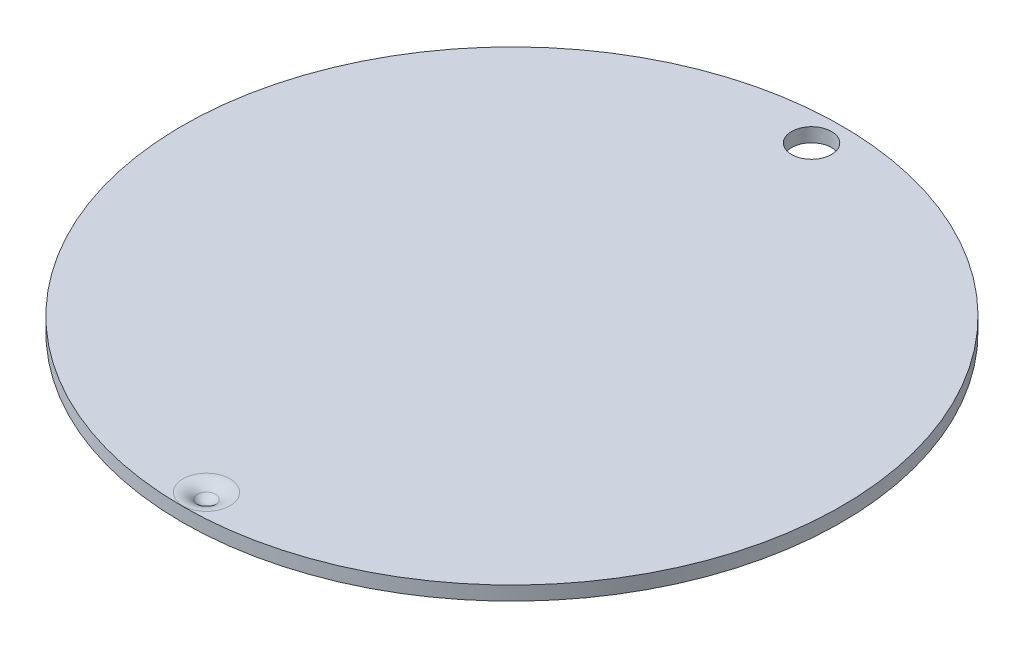
ISO-10303-21;
HEADER;
FILE_DESCRIPTION(('STEP AP214'),'2;1');
FILE_NAME('part.step','',(''),(''),'','','');
FILE_SCHEMA(('AUTOMOTIVE_DESIGN { 1 0 10303 214 1 1 1 1 }'));
ENDSEC;
DATA;
#1=APPLICATION_CONTEXT('core data for automotive mechanical design processes');
#2=APPLICATION_PROTOCOL_DEFINITION('international standard','automotive_design',2000,#1);
#3=PRODUCT_CONTEXT('',#1,'mechanical');
#4=PRODUCT('Part','Part','',(#3));
#5=PRODUCT_RELATED_PRODUCT_CATEGORY('part','',(#4));
#6=PRODUCT_DEFINITION_FORMATION('','',#4);
#7=PRODUCT_DEFINITION_CONTEXT('part definition',#1,'design');
#8=PRODUCT_DEFINITION('design','',#6,#7);
#9=PRODUCT_DEFINITION_SHAPE('','',#8);
#10=(LENGTH_UNIT() NAMED_UNIT(*) SI_UNIT(.MILLI.,.METRE.));
#11=(NAMED_UNIT(*) PLANE_ANGLE_UNIT() SI_UNIT($,.RADIAN.));
#12=(NAMED_UNIT(*) SI_UNIT($,.STERADIAN.) SOLID_ANGLE_UNIT());
#13=UNCERTAINTY_MEASURE_WITH_UNIT(LENGTH_MEASURE(1.E-05),#10,'distance_accuracy_value','');
#14=(GEOMETRIC_REPRESENTATION_CONTEXT(3) GLOBAL_UNCERTAINTY_ASSIGNED_CONTEXT((#13)) GLOBAL_UNIT_ASSIGNED_CONTEXT((#10,
#11,#12)) REPRESENTATION_CONTEXT('',''));
#15=CARTESIAN_POINT('',(0.,0.,0.));
#16=DIRECTION('',(0.,0.,1.));
#17=DIRECTION('',(1.,0.,0.));
#18=AXIS2_PLACEMENT_3D('',#15,#16,#17);
#19=CARTESIAN_POINT('',(0.,-0.7,0.));
#20=DIRECTION('',(0.,1.,0.));
#21=DIRECTION('',(0.,0.,1.));
#22=AXIS2_PLACEMENT_3D('',#19,#20,#21);
#23=CYLINDRICAL_SURFACE('',#22,16.5);
#24=CARTESIAN_POINT('',(0.,-0.7,0.));
#25=DIRECTION('',(0.,1.,0.));
#26=DIRECTION('',(0.,0.,1.));
#27=AXIS2_PLACEMENT_3D('',#24,#25,#26);
#28=CIRCLE('',#27,16.5);
#29=CARTESIAN_POINT('',(0.,-0.7,16.5));
#30=VERTEX_POINT('',#29);
#31=EDGE_CURVE('E10',#30,#30,#28,.T.);
#32=ORIENTED_EDGE('',*,*,#31,.T.);
#33=EDGE_LOOP('',(#32));
#34=FACE_BOUND('',#33,.T.);
#35=CARTESIAN_POINT('',(0.,0.,0.));
#36=DIRECTION('',(0.,1.,0.));
#37=DIRECTION('',(0.,0.,1.));
#38=AXIS2_PLACEMENT_3D('',#35,#36,#37);
#39=CIRCLE('',#38,16.5);
#40=CARTESIAN_POINT('',(0.,0.,16.5));
#41=VERTEX_POINT('',#40);
#42=EDGE_CURVE('E42',#41,#41,#39,.T.);
#43=ORIENTED_EDGE('',*,*,#42,.F.);
#44=EDGE_LOOP('',(#43));
#45=FACE_BOUND('',#44,.T.);
#46=ADVANCED_FACE('F39',(#34,#45),#23,.T.);
#47=CARTESIAN_POINT('',(0.,-0.7,0.));
#48=DIRECTION('',(0.,1.,0.));
#49=DIRECTION('',(0.,0.,1.));
#50=AXIS2_PLACEMENT_3D('',#47,#48,#49);
#51=PLANE('',#50);
#52=CARTESIAN_POINT('',(0.,-0.700000000113687,15.2911177847272));
#53=DIRECTION('',(0.,1.,0.));
#54=DIRECTION('',(0.,0.,1.));
#55=AXIS2_PLACEMENT_3D('',#52,#53,#54);
#56=CIRCLE('',#55,1.17260393995586);
#57=CARTESIAN_POINT('',(0.,-0.700000000113687,16.4637217246831));
#58=VERTEX_POINT('',#57);
#59=EDGE_CURVE('E62',#58,#58,#56,.F.);
#60=ORIENTED_EDGE('',*,*,#59,.F.);
#61=EDGE_LOOP('',(#60));
#62=FACE_BOUND('',#61,.T.);
#63=CARTESIAN_POINT('',(0.,-0.7,-15.));
#64=DIRECTION('',(0.,-1.,0.));
#65=DIRECTION('',(0.,0.,-1.));
#66=AXIS2_PLACEMENT_3D('',#63,#64,#65);
#67=CIRCLE('',#66,1.);
#68=CARTESIAN_POINT('',(0.,-0.7,-16.));
#69=VERTEX_POINT('',#68);
#70=EDGE_CURVE('E51',#69,#69,#67,.T.);
#71=ORIENTED_EDGE('',*,*,#70,.F.);
#72=EDGE_LOOP('',(#71));
#73=FACE_BOUND('',#72,.T.);
#74=ORIENTED_EDGE('',*,*,#31,.F.);
#75=EDGE_LOOP('',(#74));
#76=FACE_BOUND('',#75,.T.);
#77=ADVANCED_FACE('F85',(#62,#73,#76),#51,.F.);
#78=CARTESIAN_POINT('',(0.,0.,0.));
#79=DIRECTION('',(0.,1.,0.));
#80=DIRECTION('',(0.,0.,1.));
#81=AXIS2_PLACEMENT_3D('',#78,#79,#80);
#82=PLANE('',#81);
#83=CARTESIAN_POINT('',(0.,-1.13686837721616E-10,15.2911177847272));
#84=DIRECTION('',(0.,1.,0.));
#85=DIRECTION('',(1.,0.,0.));
#86=AXIS2_PLACEMENT_3D('',#83,#84,#85);
#87=CIRCLE('',#86,1.17260393995586);
#88=CARTESIAN_POINT('',(1.17260393995586,-1.13686837721616E-10,15.2911177847272));
#89=VERTEX_POINT('',#88);
#90=EDGE_CURVE('E59',#89,#89,#87,.F.);
#91=ORIENTED_EDGE('',*,*,#90,.T.);
#92=EDGE_LOOP('',(#91));
#93=FACE_BOUND('',#92,.T.);
#94=CARTESIAN_POINT('',(0.,0.,-15.));
#95=DIRECTION('',(0.,-1.,0.));
#96=DIRECTION('',(0.,0.,-1.));
#97=AXIS2_PLACEMENT_3D('',#94,#95,#96);
#98=CIRCLE('',#97,1.);
#99=CARTESIAN_POINT('',(0.,0.,-16.));
#100=VERTEX_POINT('',#99);
#101=EDGE_CURVE('E49',#100,#100,#98,.T.);
#102=ORIENTED_EDGE('',*,*,#101,.T.);
#103=EDGE_LOOP('',(#102));
#104=FACE_BOUND('',#103,.T.);
#105=ORIENTED_EDGE('',*,*,#42,.T.);
#106=EDGE_LOOP('',(#105));
#107=FACE_BOUND('',#106,.T.);
#108=ADVANCED_FACE('F89',(#93,#104,#107),#82,.T.);
#109=CARTESIAN_POINT('',(0.,0.,-15.));
#110=DIRECTION('',(0.,-1.,0.));
#111=DIRECTION('',(0.,0.,-1.));
#112=AXIS2_PLACEMENT_3D('',#109,#110,#111);
#113=CYLINDRICAL_SURFACE('',#112,1.);
#114=ORIENTED_EDGE('',*,*,#101,.F.);
#115=EDGE_LOOP('',(#114));
#116=FACE_BOUND('',#115,.T.);
#117=ORIENTED_EDGE('',*,*,#70,.T.);
#118=EDGE_LOOP('',(#117));
#119=FACE_BOUND('',#118,.T.);
#120=ADVANCED_FACE('F96',(#116,#119),#113,.F.);
#121=CARTESIAN_POINT('',(0.,0.124999999886313,15.2911177847272));
#122=DIRECTION('',(0.,1.,0.));
#123=DIRECTION('',(0.,0.,-1.));
#124=AXIS2_PLACEMENT_3D('',#121,#122,#123);
#125=SPHERICAL_SURFACE('',#124,0.625);
#126=CARTESIAN_POINT('',(0.,-0.307692307805995,15.2911177847272));
#127=DIRECTION('',(0.,1.,0.));
#128=DIRECTION('',(1.,0.,0.));
#129=AXIS2_PLACEMENT_3D('',#126,#127,#128);
#130=CIRCLE('',#129,0.451001515367637);
#131=CARTESIAN_POINT('',(0.451001515367637,-0.307692307805995,15.2911177847272));
#132=VERTEX_POINT('',#131);
#133=EDGE_CURVE('E54',#132,#132,#130,.F.);
#134=ORIENTED_EDGE('',*,*,#133,.F.);
#135=EDGE_LOOP('',(#134));
#136=FACE_BOUND('',#135,.T.);
#137=ADVANCED_FACE('F81',(#136),#125,.F.);
#138=CARTESIAN_POINT('',(0.,-1.00000000011369,15.2911177847272));
#139=DIRECTION('',(0.,1.,0.));
#140=DIRECTION('',(1.,0.,0.));
#141=AXIS2_PLACEMENT_3D('',#138,#139,#140);
#142=TOROIDAL_SURFACE('',#141,1.17260393995586,1.);
#143=ORIENTED_EDGE('',*,*,#90,.F.);
#144=EDGE_LOOP('',(#143));
#145=FACE_BOUND('',#144,.T.);
#146=ORIENTED_EDGE('',*,*,#133,.T.);
#147=EDGE_LOOP('',(#146));
#148=FACE_BOUND('',#147,.T.);
#149=ADVANCED_FACE('F73',(#145,#148),#142,.T.);
#150=CARTESIAN_POINT('',(0.,-1.00000000011369,15.2911177847272));
#151=DIRECTION('',(0.,1.,0.));
#152=DIRECTION('',(1.,0.,0.));
#153=AXIS2_PLACEMENT_3D('',#150,#151,#152);
#154=TOROIDAL_SURFACE('',#153,1.17260393995586,0.3);
#155=ORIENTED_EDGE('',*,*,#59,.T.);
#156=EDGE_LOOP('',(#155));
#157=FACE_BOUND('',#156,.T.);
#158=CARTESIAN_POINT('',(0.,-0.792307692421379,15.2911177847272));
#159=DIRECTION('',(0.,1.,0.));
#160=DIRECTION('',(0.,0.,1.));
#161=AXIS2_PLACEMENT_3D('',#158,#159,#160);
#162=CIRCLE('',#161,0.956123212579391);
#163=CARTESIAN_POINT('',(0.,-0.792307692421379,16.2472409973066));
#164=VERTEX_POINT('',#163);
#165=EDGE_CURVE('E65',#164,#164,#162,.F.);
#166=ORIENTED_EDGE('',*,*,#165,.F.);
#167=EDGE_LOOP('',(#166));
#168=FACE_BOUND('',#167,.T.);
#169=ADVANCED_FACE('F71',(#157,#168),#154,.F.);
#170=CARTESIAN_POINT('',(0.,0.124999999886313,15.2911177847272));
#171=DIRECTION('',(0.,1.,0.));
#172=DIRECTION('',(0.,0.,-1.));
#173=AXIS2_PLACEMENT_3D('',#170,#171,#172);
#174=SPHERICAL_SURFACE('',#173,1.325);
#175=ORIENTED_EDGE('',*,*,#165,.T.);
#176=EDGE_LOOP('',(#175));
#177=FACE_BOUND('',#176,.T.);
#178=ADVANCED_FACE('F69',(#177),#174,.T.);
#179=CLOSED_SHELL('',(#46,#77,#108,#120,#137,#149,#169,#178));
#180=MANIFOLD_SOLID_BREP('B2',#179);
#181=ADVANCED_BREP_SHAPE_REPRESENTATION('',(#18,#180),#14);
#182=SHAPE_DEFINITION_REPRESENTATION(#9,#181);
ENDSEC;
END-ISO-10303-21;
